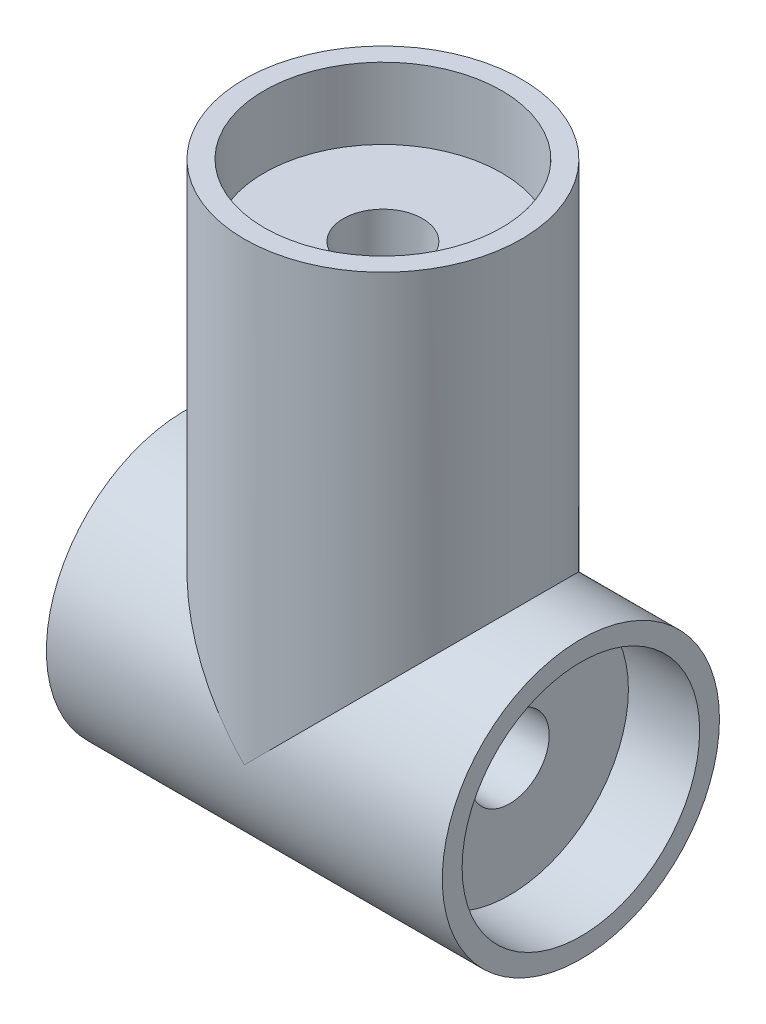
ISO-10303-21;
HEADER;
FILE_DESCRIPTION(('STEP AP214'),'2;1');
FILE_NAME('part.step','',(''),(''),'','','');
FILE_SCHEMA(('AUTOMOTIVE_DESIGN { 1 0 10303 214 1 1 1 1 }'));
ENDSEC;
DATA;
#1=APPLICATION_CONTEXT('core data for automotive mechanical design processes');
#2=APPLICATION_PROTOCOL_DEFINITION('international standard','automotive_design',2000,#1);
#3=PRODUCT_CONTEXT('',#1,'mechanical');
#4=PRODUCT('Part','Part','',(#3));
#5=PRODUCT_RELATED_PRODUCT_CATEGORY('part','',(#4));
#6=PRODUCT_DEFINITION_FORMATION('','',#4);
#7=PRODUCT_DEFINITION_CONTEXT('part definition',#1,'design');
#8=PRODUCT_DEFINITION('design','',#6,#7);
#9=PRODUCT_DEFINITION_SHAPE('','',#8);
#10=(LENGTH_UNIT() NAMED_UNIT(*) SI_UNIT(.MILLI.,.METRE.));
#11=(NAMED_UNIT(*) PLANE_ANGLE_UNIT() SI_UNIT($,.RADIAN.));
#12=(NAMED_UNIT(*) SI_UNIT($,.STERADIAN.) SOLID_ANGLE_UNIT());
#13=UNCERTAINTY_MEASURE_WITH_UNIT(LENGTH_MEASURE(1.E-05),#10,'distance_accuracy_value','');
#14=(GEOMETRIC_REPRESENTATION_CONTEXT(3) GLOBAL_UNCERTAINTY_ASSIGNED_CONTEXT((#13)) GLOBAL_UNIT_ASSIGNED_CONTEXT((#10,
#11,#12)) REPRESENTATION_CONTEXT('',''));
#15=CARTESIAN_POINT('',(0.,0.,0.));
#16=DIRECTION('',(0.,0.,1.));
#17=DIRECTION('',(1.,0.,0.));
#18=AXIS2_PLACEMENT_3D('',#15,#16,#17);
#19=CARTESIAN_POINT('',(25.,0.,0.));
#20=DIRECTION('',(-1.,0.,0.));
#21=DIRECTION('',(0.,0.,1.));
#22=AXIS2_PLACEMENT_3D('',#19,#20,#21);
#23=CYLINDRICAL_SURFACE('',#22,5.);
#24=CARTESIAN_POINT('',(16.,0.,0.));
#25=DIRECTION('',(1.,0.,0.));
#26=DIRECTION('',(0.,0.,-1.));
#27=AXIS2_PLACEMENT_3D('',#24,#25,#26);
#28=CIRCLE('',#27,5.);
#29=CARTESIAN_POINT('',(16.,0.,-5.));
#30=VERTEX_POINT('',#29);
#31=EDGE_CURVE('E79',#30,#30,#28,.T.);
#32=ORIENTED_EDGE('',*,*,#31,.T.);
#33=EDGE_LOOP('',(#32));
#34=FACE_BOUND('',#33,.T.);
#35=CARTESIAN_POINT('',(-16.,0.,0.));
#36=DIRECTION('',(1.,0.,0.));
#37=DIRECTION('',(0.,0.,-1.));
#38=AXIS2_PLACEMENT_3D('',#35,#36,#37);
#39=CIRCLE('',#38,5.);
#40=CARTESIAN_POINT('',(-16.,0.,-5.));
#41=VERTEX_POINT('',#40);
#42=EDGE_CURVE('E63',#41,#41,#39,.T.);
#43=ORIENTED_EDGE('',*,*,#42,.F.);
#44=EDGE_LOOP('',(#43));
#45=FACE_BOUND('',#44,.T.);
#46=ADVANCED_FACE('F39',(#34,#45),#23,.F.);
#47=CARTESIAN_POINT('',(-25.,0.,0.));
#48=DIRECTION('',(1.,0.,0.));
#49=DIRECTION('',(0.,0.,-1.));
#50=AXIS2_PLACEMENT_3D('',#47,#48,#49);
#51=PLANE('',#50);
#52=CARTESIAN_POINT('',(-25.,0.,0.));
#53=DIRECTION('',(1.,0.,0.));
#54=DIRECTION('',(0.,0.,-1.));
#55=AXIS2_PLACEMENT_3D('',#52,#53,#54);
#56=CIRCLE('',#55,17.5);
#57=CARTESIAN_POINT('',(-25.,0.,-17.5));
#58=VERTEX_POINT('',#57);
#59=EDGE_CURVE('E88',#58,#58,#56,.T.);
#60=ORIENTED_EDGE('',*,*,#59,.F.);
#61=EDGE_LOOP('',(#60));
#62=FACE_BOUND('',#61,.T.);
#63=CARTESIAN_POINT('',(-25.,0.,0.));
#64=DIRECTION('',(1.,0.,0.));
#65=DIRECTION('',(0.,0.,-1.));
#66=AXIS2_PLACEMENT_3D('',#63,#64,#65);
#67=CIRCLE('',#66,15.);
#68=CARTESIAN_POINT('',(-25.,0.,-15.));
#69=VERTEX_POINT('',#68);
#70=EDGE_CURVE('E75',#69,#69,#67,.T.);
#71=ORIENTED_EDGE('',*,*,#70,.T.);
#72=EDGE_LOOP('',(#71));
#73=FACE_BOUND('',#72,.T.);
#74=ADVANCED_FACE('F96',(#62,#73),#51,.F.);
#75=CARTESIAN_POINT('',(25.,0.,0.));
#76=DIRECTION('',(1.,0.,0.));
#77=DIRECTION('',(0.,0.,-1.));
#78=AXIS2_PLACEMENT_3D('',#75,#76,#77);
#79=PLANE('',#78);
#80=CARTESIAN_POINT('',(25.,0.,0.));
#81=DIRECTION('',(1.,0.,0.));
#82=DIRECTION('',(0.,0.,-1.));
#83=AXIS2_PLACEMENT_3D('',#80,#81,#82);
#84=CIRCLE('',#83,15.);
#85=CARTESIAN_POINT('',(25.,0.,-15.));
#86=VERTEX_POINT('',#85);
#87=EDGE_CURVE('E84',#86,#86,#84,.T.);
#88=ORIENTED_EDGE('',*,*,#87,.F.);
#89=EDGE_LOOP('',(#88));
#90=FACE_BOUND('',#89,.T.);
#91=CARTESIAN_POINT('',(25.,0.,0.));
#92=DIRECTION('',(1.,0.,0.));
#93=DIRECTION('',(0.,0.,-1.));
#94=AXIS2_PLACEMENT_3D('',#91,#92,#93);
#95=CIRCLE('',#94,17.5);
#96=CARTESIAN_POINT('',(25.,0.,-17.5));
#97=VERTEX_POINT('',#96);
#98=EDGE_CURVE('E52',#97,#97,#95,.T.);
#99=ORIENTED_EDGE('',*,*,#98,.T.);
#100=EDGE_LOOP('',(#99));
#101=FACE_BOUND('',#100,.T.);
#102=ADVANCED_FACE('F99',(#90,#101),#79,.T.);
#103=CARTESIAN_POINT('',(25.,0.,0.));
#104=DIRECTION('',(-1.,0.,0.));
#105=DIRECTION('',(0.,0.,1.));
#106=AXIS2_PLACEMENT_3D('',#103,#104,#105);
#107=CYLINDRICAL_SURFACE('',#106,17.5);
#108=CARTESIAN_POINT('',(0.,0.,0.));
#109=DIRECTION('',(0.707106781186547,0.707106781186547,0.));
#110=DIRECTION('',(-0.707106781186547,0.707106781186547,0.));
#111=AXIS2_PLACEMENT_3D('',#108,#109,#110);
#112=ELLIPSE('',#111,24.7487373415292,17.5);
#113=CARTESIAN_POINT('',(0.,0.,-17.5));
#114=VERTEX_POINT('',#113);
#115=CARTESIAN_POINT('',(0.,0.,17.5));
#116=VERTEX_POINT('',#115);
#117=EDGE_CURVE('E60',#114,#116,#112,.T.);
#118=ORIENTED_EDGE('',*,*,#117,.F.);
#119=CARTESIAN_POINT('',(0.,0.,0.));
#120=DIRECTION('',(-0.707106781186547,0.707106781186547,0.));
#121=DIRECTION('',(0.707106781186547,0.707106781186547,0.));
#122=AXIS2_PLACEMENT_3D('',#119,#120,#121);
#123=ELLIPSE('',#122,24.7487373415292,17.5);
#124=EDGE_CURVE('E58',#116,#114,#123,.T.);
#125=ORIENTED_EDGE('',*,*,#124,.F.);
#126=EDGE_LOOP('',(#118,#125));
#127=FACE_BOUND('',#126,.T.);
#128=ORIENTED_EDGE('',*,*,#98,.F.);
#129=EDGE_LOOP('',(#128));
#130=FACE_BOUND('',#129,.T.);
#131=ORIENTED_EDGE('',*,*,#59,.T.);
#132=EDGE_LOOP('',(#131));
#133=FACE_BOUND('',#132,.T.);
#134=ADVANCED_FACE('F41',(#127,#130,#133),#107,.T.);
#135=CARTESIAN_POINT('',(16.,0.,0.));
#136=DIRECTION('',(1.,0.,0.));
#137=DIRECTION('',(0.,0.,-1.));
#138=AXIS2_PLACEMENT_3D('',#135,#136,#137);
#139=CYLINDRICAL_SURFACE('',#138,15.);
#140=CARTESIAN_POINT('',(16.,0.,0.));
#141=DIRECTION('',(1.,0.,0.));
#142=DIRECTION('',(0.,0.,-1.));
#143=AXIS2_PLACEMENT_3D('',#140,#141,#142);
#144=CIRCLE('',#143,15.);
#145=CARTESIAN_POINT('',(16.,0.,-15.));
#146=VERTEX_POINT('',#145);
#147=EDGE_CURVE('E85',#146,#146,#144,.T.);
#148=ORIENTED_EDGE('',*,*,#147,.F.);
#149=EDGE_LOOP('',(#148));
#150=FACE_BOUND('',#149,.T.);
#151=ORIENTED_EDGE('',*,*,#87,.T.);
#152=EDGE_LOOP('',(#151));
#153=FACE_BOUND('',#152,.T.);
#154=ADVANCED_FACE('F128',(#150,#153),#139,.F.);
#155=CARTESIAN_POINT('',(16.,0.,0.));
#156=DIRECTION('',(1.,0.,0.));
#157=DIRECTION('',(0.,0.,-1.));
#158=AXIS2_PLACEMENT_3D('',#155,#156,#157);
#159=PLANE('',#158);
#160=ORIENTED_EDGE('',*,*,#31,.F.);
#161=EDGE_LOOP('',(#160));
#162=FACE_BOUND('',#161,.T.);
#163=ORIENTED_EDGE('',*,*,#147,.T.);
#164=EDGE_LOOP('',(#163));
#165=FACE_BOUND('',#164,.T.);
#166=ADVANCED_FACE('F115',(#162,#165),#159,.T.);
#167=CARTESIAN_POINT('',(-16.,0.,0.));
#168=DIRECTION('',(-1.,0.,0.));
#169=DIRECTION('',(0.,0.,-1.));
#170=AXIS2_PLACEMENT_3D('',#167,#168,#169);
#171=PLANE('',#170);
#172=CARTESIAN_POINT('',(-16.,0.,0.));
#173=DIRECTION('',(1.,0.,0.));
#174=DIRECTION('',(0.,0.,-1.));
#175=AXIS2_PLACEMENT_3D('',#172,#173,#174);
#176=CIRCLE('',#175,15.);
#177=CARTESIAN_POINT('',(-16.,0.,-15.));
#178=VERTEX_POINT('',#177);
#179=EDGE_CURVE('E76',#178,#178,#176,.T.);
#180=ORIENTED_EDGE('',*,*,#179,.F.);
#181=EDGE_LOOP('',(#180));
#182=FACE_BOUND('',#181,.T.);
#183=ORIENTED_EDGE('',*,*,#42,.T.);
#184=EDGE_LOOP('',(#183));
#185=FACE_BOUND('',#184,.T.);
#186=ADVANCED_FACE('F104',(#182,#185),#171,.T.);
#187=CARTESIAN_POINT('',(-16.,0.,0.));
#188=DIRECTION('',(-1.,0.,0.));
#189=DIRECTION('',(0.,0.,1.));
#190=AXIS2_PLACEMENT_3D('',#187,#188,#189);
#191=CYLINDRICAL_SURFACE('',#190,15.);
#192=ORIENTED_EDGE('',*,*,#179,.T.);
#193=EDGE_LOOP('',(#192));
#194=FACE_BOUND('',#193,.T.);
#195=ORIENTED_EDGE('',*,*,#70,.F.);
#196=EDGE_LOOP('',(#195));
#197=FACE_BOUND('',#196,.T.);
#198=ADVANCED_FACE('F102',(#194,#197),#191,.F.);
#199=CARTESIAN_POINT('',(0.,-17.501,0.));
#200=DIRECTION('',(0.,1.,0.));
#201=DIRECTION('',(0.,0.,1.));
#202=AXIS2_PLACEMENT_3D('',#199,#200,#201);
#203=CYLINDRICAL_SURFACE('',#202,17.5);
#204=CARTESIAN_POINT('',(0.,57.5,0.));
#205=DIRECTION('',(0.,1.,0.));
#206=DIRECTION('',(0.,0.,1.));
#207=AXIS2_PLACEMENT_3D('',#204,#205,#206);
#208=CIRCLE('',#207,17.5);
#209=CARTESIAN_POINT('',(0.,57.5,17.5));
#210=VERTEX_POINT('',#209);
#211=EDGE_CURVE('E66',#210,#210,#208,.T.);
#212=ORIENTED_EDGE('',*,*,#211,.F.);
#213=EDGE_LOOP('',(#212));
#214=FACE_BOUND('',#213,.T.);
#215=ORIENTED_EDGE('',*,*,#117,.T.);
#216=ORIENTED_EDGE('',*,*,#124,.T.);
#217=EDGE_LOOP('',(#215,#216));
#218=FACE_BOUND('',#217,.T.);
#219=ADVANCED_FACE('F61',(#214,#218),#203,.T.);
#220=CARTESIAN_POINT('',(0.,57.5,0.));
#221=DIRECTION('',(0.,1.,0.));
#222=DIRECTION('',(0.,0.,1.));
#223=AXIS2_PLACEMENT_3D('',#220,#221,#222);
#224=PLANE('',#223);
#225=CARTESIAN_POINT('',(0.,57.5,0.));
#226=DIRECTION('',(0.,1.,0.));
#227=DIRECTION('',(0.,0.,1.));
#228=AXIS2_PLACEMENT_3D('',#225,#226,#227);
#229=CIRCLE('',#228,15.);
#230=CARTESIAN_POINT('',(0.,57.5,15.));
#231=VERTEX_POINT('',#230);
#232=EDGE_CURVE('E233',#231,#231,#229,.T.);
#233=ORIENTED_EDGE('',*,*,#232,.F.);
#234=EDGE_LOOP('',(#233));
#235=FACE_BOUND('',#234,.T.);
#236=ORIENTED_EDGE('',*,*,#211,.T.);
#237=EDGE_LOOP('',(#236));
#238=FACE_BOUND('',#237,.T.);
#239=ADVANCED_FACE('F112',(#235,#238),#224,.T.);
#240=CARTESIAN_POINT('',(0.,48.5,0.));
#241=DIRECTION('',(0.,1.,0.));
#242=DIRECTION('',(0.,0.,1.));
#243=AXIS2_PLACEMENT_3D('',#240,#241,#242);
#244=CYLINDRICAL_SURFACE('',#243,15.);
#245=CARTESIAN_POINT('',(0.,48.5,0.));
#246=DIRECTION('',(0.,1.,0.));
#247=DIRECTION('',(0.,0.,1.));
#248=AXIS2_PLACEMENT_3D('',#245,#246,#247);
#249=CIRCLE('',#248,15.);
#250=CARTESIAN_POINT('',(0.,48.5,15.));
#251=VERTEX_POINT('',#250);
#252=EDGE_CURVE('E69',#251,#251,#249,.T.);
#253=ORIENTED_EDGE('',*,*,#252,.F.);
#254=EDGE_LOOP('',(#253));
#255=FACE_BOUND('',#254,.T.);
#256=ORIENTED_EDGE('',*,*,#232,.T.);
#257=EDGE_LOOP('',(#256));
#258=FACE_BOUND('',#257,.T.);
#259=ADVANCED_FACE('F196',(#255,#258),#244,.F.);
#260=CARTESIAN_POINT('',(0.,48.5,0.));
#261=DIRECTION('',(0.,1.,0.));
#262=DIRECTION('',(0.,0.,1.));
#263=AXIS2_PLACEMENT_3D('',#260,#261,#262);
#264=PLANE('',#263);
#265=CARTESIAN_POINT('',(0.,48.5,0.));
#266=DIRECTION('',(0.,1.,0.));
#267=DIRECTION('',(0.,0.,1.));
#268=AXIS2_PLACEMENT_3D('',#265,#266,#267);
#269=CIRCLE('',#268,5.);
#270=CARTESIAN_POINT('',(0.,48.5,5.));
#271=VERTEX_POINT('',#270);
#272=EDGE_CURVE('E230',#271,#271,#269,.T.);
#273=ORIENTED_EDGE('',*,*,#272,.F.);
#274=EDGE_LOOP('',(#273));
#275=FACE_BOUND('',#274,.T.);
#276=ORIENTED_EDGE('',*,*,#252,.T.);
#277=EDGE_LOOP('',(#276));
#278=FACE_BOUND('',#277,.T.);
#279=ADVANCED_FACE('F182',(#275,#278),#264,.T.);
#280=CARTESIAN_POINT('',(0.,16.7705098312484,5.));
#281=CARTESIAN_POINT('',(-0.274628844696468,16.7705136752802,4.99999505116229));
#282=CARTESIAN_POINT('',(-0.549307710637177,16.7773294919902,4.97729666498942));
#283=CARTESIAN_POINT('',(-1.09067809715654,16.8037597301675,4.88730908475421));
#284=CARTESIAN_POINT('',(-1.35736632275132,16.8233793574095,4.82000175340817));
#285=CARTESIAN_POINT('',(-1.87484300217899,16.8730177380413,4.64323358232184));
#286=CARTESIAN_POINT('',(-2.12565537954291,16.903020381435,4.5338380162969));
#287=CARTESIAN_POINT('',(-2.60541952888586,16.9700230274029,4.27620910157339));
#288=CARTESIAN_POINT('',(-2.83436870094507,17.0070238606297,4.12797114165866));
#289=CARTESIAN_POINT('',(-3.2704789132871,17.0850445803541,3.79231200245499));
#290=CARTESIAN_POINT('',(-3.47691950532304,17.1261438991038,3.60397302783124));
#291=CARTESIAN_POINT('',(-3.85575695825947,17.2070491378004,3.19542811367317));
#292=CARTESIAN_POINT('',(-4.0281498328071,17.2468549058413,2.97521844789908));
#293=CARTESIAN_POINT('',(-4.33707162088379,17.3215833000378,2.50411508039398));
#294=CARTESIAN_POINT('',(-4.47287404937745,17.3564013625217,2.25272695940467));
#295=CARTESIAN_POINT('',(-4.70000443603992,17.4163135121383,1.7295211880991));
#296=CARTESIAN_POINT('',(-4.79134105310066,17.4414094922717,1.45770752718793));
#297=CARTESIAN_POINT('',(-4.92458615309928,17.4784879825059,0.908896437802947));
#298=CARTESIAN_POINT('',(-4.96772255426168,17.4907956752825,0.632219495322605));
#299=CARTESIAN_POINT('',(-5.00721683470808,17.5020523914924,0.0753002560548095));
#300=CARTESIAN_POINT('',(-5.00358365584338,17.5010039684748,-0.204941348971377));
#301=CARTESIAN_POINT('',(-4.95048406270495,17.4859001690825,-0.75245048933804));
#302=CARTESIAN_POINT('',(-4.9023459684051,17.4722217694006,-1.01985886527233));
#303=CARTESIAN_POINT('',(-4.76376224383901,17.4338471582541,-1.54263055544407));
#304=CARTESIAN_POINT('',(-4.67331403934448,17.4091502764082,-1.79799313575139));
#305=CARTESIAN_POINT('',(-4.45172649797068,17.3509757943002,-2.29268458432219));
#306=CARTESIAN_POINT('',(-4.32015305548002,17.3174051377936,-2.53180760962649));
#307=CARTESIAN_POINT('',(-4.02038853400409,17.2450692243607,-2.98501810897665));
#308=CARTESIAN_POINT('',(-3.85218943083064,17.206302829835,-3.19910008104167));
#309=CARTESIAN_POINT('',(-3.47698572345681,17.126142075453,-3.60408162136767));
#310=CARTESIAN_POINT('',(-3.26882641599982,17.0847032340922,-3.79390394395576));
#311=CARTESIAN_POINT('',(-2.82321227037267,17.0050743448172,-4.13623253938088));
#312=CARTESIAN_POINT('',(-2.58575505758103,16.9668845606664,-4.28873578448073));
#313=CARTESIAN_POINT('',(-2.08567278879165,16.8978793698223,-4.55308339961718));
#314=CARTESIAN_POINT('',(-1.82286193752493,16.8671252714536,-4.66459344463694));
#315=CARTESIAN_POINT('',(-1.28111709139855,16.8172136076759,-4.84147378731837));
#316=CARTESIAN_POINT('',(-1.00218781339884,16.7980526683094,-4.90685751004532));
#317=CARTESIAN_POINT('',(-0.446298939135175,16.7742278804166,-4.9876854300169));
#318=CARTESIAN_POINT('',(-0.169595457658345,16.7690927830537,-5.00475370393915));
#319=CARTESIAN_POINT('',(0.382720789793296,16.772603989784,-4.99297491798634));
#320=CARTESIAN_POINT('',(0.658333687524892,16.7812485747779,-4.96413358561466));
#321=CARTESIAN_POINT('',(1.19410307005975,16.8108857513785,-4.86279453564956));
#322=CARTESIAN_POINT('',(1.45446896503853,16.8315910741458,-4.79131155460387));
#323=CARTESIAN_POINT('',(1.9595046799937,16.8827265982588,-4.60787904666037));
#324=CARTESIAN_POINT('',(2.20417222911395,16.9131582027759,-4.4959236806691));
#325=CARTESIAN_POINT('',(2.67755518804204,16.9812547002374,-4.23154912804069));
#326=CARTESIAN_POINT('',(2.90572611050553,17.0190799345288,-4.07819729322831));
#327=CARTESIAN_POINT('',(3.33369093360835,17.0973431637451,-3.73651159212101));
#328=CARTESIAN_POINT('',(3.53347866753033,17.1377817236901,-3.54817014420341));
#329=CARTESIAN_POINT('',(3.90594854572047,17.2183681859024,-3.1342700249139));
#330=CARTESIAN_POINT('',(4.07748742854683,17.2584601511536,-2.90766927560137));
#331=CARTESIAN_POINT('',(4.38011420345682,17.3324494261499,-2.42796326764386));
#332=CARTESIAN_POINT('',(4.51120420980594,17.3663470596353,-2.17485939524546));
#333=CARTESIAN_POINT('',(4.72796071756582,17.4239126211601,-1.65108318239042));
#334=CARTESIAN_POINT('',(4.8139709739654,17.4476577031811,-1.38056199974909));
#335=CARTESIAN_POINT('',(4.93906700485044,17.4825834905972,-0.828114121374803));
#336=CARTESIAN_POINT('',(4.97816485045327,17.4937674280757,-0.546190378963579));
#337=CARTESIAN_POINT('',(5.00747858499449,17.5021333750819,0.0104455948975596));
#338=CARTESIAN_POINT('',(4.99936037270712,17.4997925897242,0.285064077624841));
#339=CARTESIAN_POINT('',(4.9384042964742,17.4824767280541,0.828862931055063));
#340=CARTESIAN_POINT('',(4.88556857404462,17.4675022567675,1.09804356154402));
#341=CARTESIAN_POINT('',(4.73767159755315,17.4267200465002,1.62101033259877));
#342=CARTESIAN_POINT('',(4.64299205264108,17.4010103511944,1.8749125835869));
#343=CARTESIAN_POINT('',(4.41443460428528,17.3414273535962,2.36336800690437));
#344=CARTESIAN_POINT('',(4.28055063226556,17.3075527875816,2.59791817645439));
#345=CARTESIAN_POINT('',(3.97275665644189,17.2339738859666,3.04858364088201));
#346=CARTESIAN_POINT('',(3.79777478304385,17.1941261445115,3.26394332000722));
#347=CARTESIAN_POINT('',(3.41472718635027,17.1136016248075,3.66280305580643));
#348=CARTESIAN_POINT('',(3.20665232223234,17.072924620217,3.8462942805136));
#349=CARTESIAN_POINT('',(2.75675770756229,16.9941009380425,4.18102115069257));
#350=CARTESIAN_POINT('',(2.51419513144378,16.9560487921203,4.33128291794634));
#351=CARTESIAN_POINT('',(2.00619533691864,16.8882111312178,4.58869859034646));
#352=CARTESIAN_POINT('',(1.74077102233553,16.8584209924773,4.69587662208439));
#353=CARTESIAN_POINT('',(1.23086574937793,16.8139614893653,4.85246335034129));
#354=CARTESIAN_POINT('',(0.988274129732822,16.7978109709708,4.90764749955105));
#355=CARTESIAN_POINT('',(0.497134704131068,16.776084236542,4.98141517608442));
#356=CARTESIAN_POINT('',(0.248587844425297,16.7705063517174,5.00000447957643));
#357=CARTESIAN_POINT('',(0.,16.7705098312484,5.));
#358=B_SPLINE_CURVE_WITH_KNOTS('',3,(#280,#281,#282,#283,#284,#285,#286,#287,#288,#289,#290,
#291,#292,#293,#294,#295,#296,#297,#298,#299,#300,#301,#302,#303,#304,#305,#306,#307,#308,#309,
#310,#311,#312,#313,#314,#315,#316,#317,#318,#319,#320,#321,#322,#323,#324,#325,#326,#327,#328,
#329,#330,#331,#332,#333,#334,#335,#336,#337,#338,#339,#340,#341,#342,#343,#344,#345,#346,#347,
#348,#349,#350,#351,#352,#353,#354,#355,#356,#357),.UNSPECIFIED.,.T.,.F.,(4,2,2,2,2,2,2,2,2,2,2,
2,2,2,2,2,2,2,2,2,2,2,2,2,2,2,2,2,2,2,2,2,2,2,2,2,2,2,4),(0.,0.822970855909875,1.64627652404715,
2.46831045934109,3.29044202751837,4.13392918016541,4.97751503096207,5.83678707534615,
6.69589172544264,7.53257252571854,8.36909336381044,9.18142594108553,9.99380794866304,
10.8150725844623,11.6365173296209,12.486790317325,13.337132265744,14.194263015785,
15.0511441949007,15.8788590834124,16.7064707175367,17.5151322414882,18.3239104804764,
19.152700151135,19.981669615578,20.8386347094918,21.6955550021916,22.5458421325277,
23.3959104269914,24.2161724421769,25.0363951773398,25.8492853098057,26.662301338656,
27.4994942187097,28.3369187479583,29.1963403106311,30.0552799305204,30.8003322217915,
31.5452669038042),.UNSPECIFIED.);
#359=CARTESIAN_POINT('',(0.,16.7705098312484,5.));
#360=VERTEX_POINT('',#359);
#361=EDGE_CURVE('E11',#360,#360,#358,.T.);
#362=ORIENTED_EDGE('',*,*,#361,.F.);
#363=EDGE_LOOP('',(#362));
#364=FACE_BOUND('',#363,.T.);
#365=ADVANCED_FACE('F134',(#364),#107,.T.);
#366=CARTESIAN_POINT('',(0.,-17.501,0.));
#367=DIRECTION('',(0.,1.,0.));
#368=DIRECTION('',(0.,0.,1.));
#369=AXIS2_PLACEMENT_3D('',#366,#367,#368);
#370=CYLINDRICAL_SURFACE('',#369,5.);
#371=ORIENTED_EDGE('',*,*,#361,.T.);
#372=EDGE_LOOP('',(#371));
#373=FACE_BOUND('',#372,.T.);
#374=ORIENTED_EDGE('',*,*,#272,.T.);
#375=EDGE_LOOP('',(#374));
#376=FACE_BOUND('',#375,.T.);
#377=ADVANCED_FACE('F181',(#373,#376),#370,.F.);
#378=CLOSED_SHELL('',(#46,#74,#102,#134,#154,#166,#186,#198,#219,#239,#259,#279,#365,#377));
#379=MANIFOLD_SOLID_BREP('B2',#378);
#380=ADVANCED_BREP_SHAPE_REPRESENTATION('',(#18,#379),#14);
#381=SHAPE_DEFINITION_REPRESENTATION(#9,#380);
ENDSEC;
END-ISO-10303-21;
